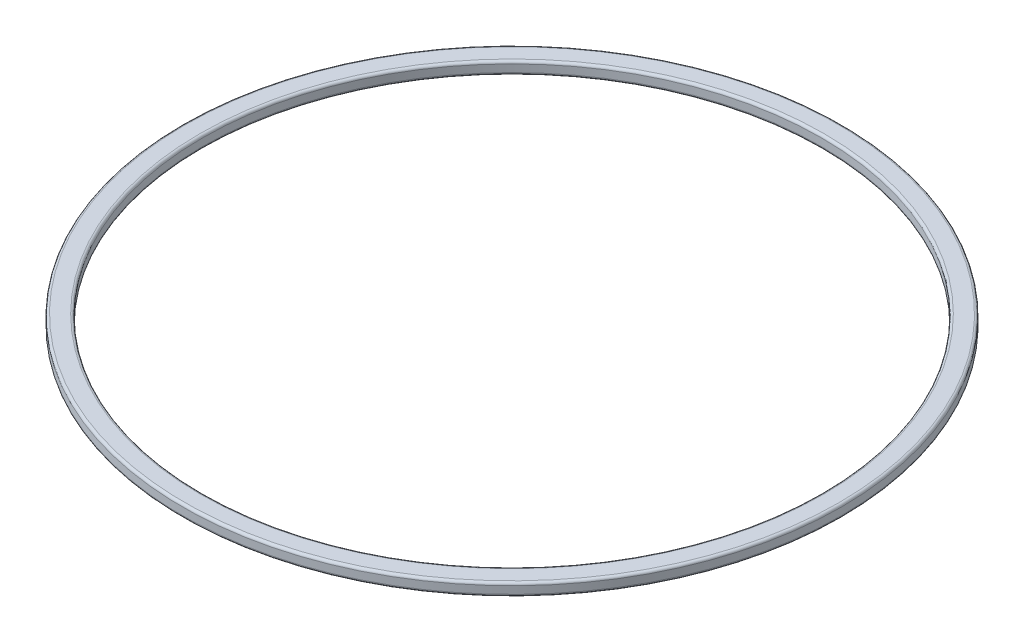
ISO-10303-21;
HEADER;
FILE_DESCRIPTION(('STEP AP214'),'2;1');
FILE_NAME('part.step','',(''),(''),'','','');
FILE_SCHEMA(('AUTOMOTIVE_DESIGN { 1 0 10303 214 1 1 1 1 }'));
ENDSEC;
DATA;
#1=APPLICATION_CONTEXT('core data for automotive mechanical design processes');
#2=APPLICATION_PROTOCOL_DEFINITION('international standard','automotive_design',2000,#1);
#3=PRODUCT_CONTEXT('',#1,'mechanical');
#4=PRODUCT('Part','Part','',(#3));
#5=PRODUCT_RELATED_PRODUCT_CATEGORY('part','',(#4));
#6=PRODUCT_DEFINITION_FORMATION('','',#4);
#7=PRODUCT_DEFINITION_CONTEXT('part definition',#1,'design');
#8=PRODUCT_DEFINITION('design','',#6,#7);
#9=PRODUCT_DEFINITION_SHAPE('','',#8);
#10=(LENGTH_UNIT() NAMED_UNIT(*) SI_UNIT(.MILLI.,.METRE.));
#11=(NAMED_UNIT(*) PLANE_ANGLE_UNIT() SI_UNIT($,.RADIAN.));
#12=(NAMED_UNIT(*) SI_UNIT($,.STERADIAN.) SOLID_ANGLE_UNIT());
#13=UNCERTAINTY_MEASURE_WITH_UNIT(LENGTH_MEASURE(1.E-05),#10,'distance_accuracy_value','');
#14=(GEOMETRIC_REPRESENTATION_CONTEXT(3) GLOBAL_UNCERTAINTY_ASSIGNED_CONTEXT((#13)) GLOBAL_UNIT_ASSIGNED_CONTEXT((#10,
#11,#12)) REPRESENTATION_CONTEXT('',''));
#15=CARTESIAN_POINT('',(0.,0.,0.));
#16=DIRECTION('',(0.,0.,1.));
#17=DIRECTION('',(1.,0.,0.));
#18=AXIS2_PLACEMENT_3D('',#15,#16,#17);
#19=CARTESIAN_POINT('',(66.,-2.,0.));
#20=DIRECTION('',(0.,-1.,0.));
#21=DIRECTION('',(-1.,0.,0.));
#22=AXIS2_PLACEMENT_3D('',#19,#20,#21);
#23=TOROIDAL_SURFACE('',#22,65.5,0.5);
#24=CARTESIAN_POINT('',(66.,-2.5,0.));
#25=DIRECTION('',(0.,-1.,0.));
#26=DIRECTION('',(-1.,0.,0.));
#27=AXIS2_PLACEMENT_3D('',#24,#25,#26);
#28=CIRCLE('',#27,65.5);
#29=CARTESIAN_POINT('',(131.5,-2.5,0.));
#30=VERTEX_POINT('',#29);
#31=EDGE_CURVE('E28',#30,#30,#28,.T.);
#32=ORIENTED_EDGE('',*,*,#31,.F.);
#33=CARTESIAN_POINT('',(131.5,-2.,0.));
#34=DIRECTION('',(0.,0.,1.));
#35=DIRECTION('',(1.,0.,0.));
#36=AXIS2_PLACEMENT_3D('',#33,#34,#35);
#37=CIRCLE('',#36,0.5);
#38=CARTESIAN_POINT('',(132.,-2.,0.));
#39=VERTEX_POINT('',#38);
#40=EDGE_CURVE('E11',#30,#39,#37,.T.);
#41=ORIENTED_EDGE('',*,*,#40,.T.);
#42=CARTESIAN_POINT('',(66.,-2.,0.));
#43=DIRECTION('',(0.,1.,0.));
#44=DIRECTION('',(-1.,0.,0.));
#45=AXIS2_PLACEMENT_3D('',#42,#43,#44);
#46=CIRCLE('',#45,66.);
#47=EDGE_CURVE('E92',#39,#39,#46,.T.);
#48=ORIENTED_EDGE('',*,*,#47,.F.);
#49=ORIENTED_EDGE('',*,*,#40,.F.);
#50=EDGE_LOOP('',(#32,#41,#48,#49));
#51=FACE_BOUND('',#50,.T.);
#52=ADVANCED_FACE('F17',(#51),#23,.T.);
#53=CARTESIAN_POINT('',(66.,-2.5,0.));
#54=DIRECTION('',(0.,-1.,0.));
#55=DIRECTION('',(0.,0.,-1.));
#56=AXIS2_PLACEMENT_3D('',#53,#54,#55);
#57=PLANE('',#56);
#58=CARTESIAN_POINT('',(66.,-2.5,0.));
#59=DIRECTION('',(0.,-1.,0.));
#60=DIRECTION('',(-1.,0.,0.));
#61=AXIS2_PLACEMENT_3D('',#58,#59,#60);
#62=CIRCLE('',#61,62.5);
#63=CARTESIAN_POINT('',(128.5,-2.5,0.));
#64=VERTEX_POINT('',#63);
#65=EDGE_CURVE('E97',#64,#64,#62,.T.);
#66=ORIENTED_EDGE('',*,*,#65,.F.);
#67=EDGE_LOOP('',(#66));
#68=FACE_BOUND('',#67,.T.);
#69=ORIENTED_EDGE('',*,*,#31,.T.);
#70=EDGE_LOOP('',(#69));
#71=FACE_BOUND('',#70,.T.);
#72=ADVANCED_FACE('F143',(#68,#71),#57,.T.);
#73=CARTESIAN_POINT('',(66.,-2.,0.));
#74=DIRECTION('',(0.,-1.,0.));
#75=DIRECTION('',(-1.,0.,0.));
#76=AXIS2_PLACEMENT_3D('',#73,#74,#75);
#77=TOROIDAL_SURFACE('',#76,62.5,0.5);
#78=CARTESIAN_POINT('',(66.,-2.,0.));
#79=DIRECTION('',(0.,-1.,0.));
#80=DIRECTION('',(-1.,0.,0.));
#81=AXIS2_PLACEMENT_3D('',#78,#79,#80);
#82=CIRCLE('',#81,62.);
#83=CARTESIAN_POINT('',(128.,-2.,0.));
#84=VERTEX_POINT('',#83);
#85=EDGE_CURVE('E86',#84,#84,#82,.T.);
#86=ORIENTED_EDGE('',*,*,#85,.F.);
#87=CARTESIAN_POINT('',(128.5,-2.,0.));
#88=DIRECTION('',(0.,0.,1.));
#89=DIRECTION('',(1.,0.,0.));
#90=AXIS2_PLACEMENT_3D('',#87,#88,#89);
#91=CIRCLE('',#90,0.5);
#92=EDGE_CURVE('E90',#84,#64,#91,.T.);
#93=ORIENTED_EDGE('',*,*,#92,.T.);
#94=ORIENTED_EDGE('',*,*,#65,.T.);
#95=ORIENTED_EDGE('',*,*,#92,.F.);
#96=EDGE_LOOP('',(#86,#93,#94,#95));
#97=FACE_BOUND('',#96,.T.);
#98=ADVANCED_FACE('F147',(#97),#77,.T.);
#99=CARTESIAN_POINT('',(66.,0.125,0.));
#100=DIRECTION('',(0.,-1.,0.));
#101=DIRECTION('',(-1.,0.,0.));
#102=AXIS2_PLACEMENT_3D('',#99,#100,#101);
#103=CYLINDRICAL_SURFACE('',#102,62.);
#104=CARTESIAN_POINT('',(66.,-0.5,0.));
#105=DIRECTION('',(0.,-1.,0.));
#106=DIRECTION('',(-1.,0.,0.));
#107=AXIS2_PLACEMENT_3D('',#104,#105,#106);
#108=CIRCLE('',#107,62.);
#109=CARTESIAN_POINT('',(128.,-0.5,0.));
#110=VERTEX_POINT('',#109);
#111=EDGE_CURVE('E103',#110,#110,#108,.T.);
#112=ORIENTED_EDGE('',*,*,#111,.F.);
#113=DIRECTION('',(0.,-1.,0.));
#114=VECTOR('',#113,1.);
#115=CARTESIAN_POINT('',(128.,0.125,0.));
#116=LINE('',#115,#114);
#117=EDGE_CURVE('E91',#110,#84,#116,.T.);
#118=ORIENTED_EDGE('',*,*,#117,.T.);
#119=ORIENTED_EDGE('',*,*,#85,.T.);
#120=ORIENTED_EDGE('',*,*,#117,.F.);
#121=EDGE_LOOP('',(#112,#118,#119,#120));
#122=FACE_BOUND('',#121,.T.);
#123=ADVANCED_FACE('F124',(#122),#103,.F.);
#124=CARTESIAN_POINT('',(66.,-0.5,0.));
#125=DIRECTION('',(0.,-1.,0.));
#126=DIRECTION('',(-1.,0.,0.));
#127=AXIS2_PLACEMENT_3D('',#124,#125,#126);
#128=TOROIDAL_SURFACE('',#127,62.5,0.5);
#129=CARTESIAN_POINT('',(66.,0.,0.));
#130=DIRECTION('',(0.,-1.,0.));
#131=DIRECTION('',(-1.,0.,0.));
#132=AXIS2_PLACEMENT_3D('',#129,#130,#131);
#133=CIRCLE('',#132,62.5);
#134=CARTESIAN_POINT('',(128.5,0.,0.));
#135=VERTEX_POINT('',#134);
#136=EDGE_CURVE('E75',#135,#135,#133,.T.);
#137=ORIENTED_EDGE('',*,*,#136,.F.);
#138=CARTESIAN_POINT('',(128.5,-0.5,0.));
#139=DIRECTION('',(0.,0.,1.));
#140=DIRECTION('',(1.,0.,0.));
#141=AXIS2_PLACEMENT_3D('',#138,#139,#140);
#142=CIRCLE('',#141,0.5);
#143=EDGE_CURVE('E82',#135,#110,#142,.T.);
#144=ORIENTED_EDGE('',*,*,#143,.T.);
#145=ORIENTED_EDGE('',*,*,#111,.T.);
#146=ORIENTED_EDGE('',*,*,#143,.F.);
#147=EDGE_LOOP('',(#137,#144,#145,#146));
#148=FACE_BOUND('',#147,.T.);
#149=ADVANCED_FACE('F19',(#148),#128,.T.);
#150=CARTESIAN_POINT('',(66.,0.,0.));
#151=DIRECTION('',(0.,-1.,0.));
#152=DIRECTION('',(0.,0.,-1.));
#153=AXIS2_PLACEMENT_3D('',#150,#151,#152);
#154=PLANE('',#153);
#155=ORIENTED_EDGE('',*,*,#136,.T.);
#156=EDGE_LOOP('',(#155));
#157=FACE_BOUND('',#156,.T.);
#158=CARTESIAN_POINT('',(66.,0.,0.));
#159=DIRECTION('',(0.,1.,0.));
#160=DIRECTION('',(-1.,0.,0.));
#161=AXIS2_PLACEMENT_3D('',#158,#159,#160);
#162=CIRCLE('',#161,65.5);
#163=CARTESIAN_POINT('',(131.5,0.,0.));
#164=VERTEX_POINT('',#163);
#165=EDGE_CURVE('E72',#164,#164,#162,.T.);
#166=ORIENTED_EDGE('',*,*,#165,.T.);
#167=EDGE_LOOP('',(#166));
#168=FACE_BOUND('',#167,.T.);
#169=ADVANCED_FACE('F73',(#157,#168),#154,.F.);
#170=CARTESIAN_POINT('',(66.,-0.5,0.));
#171=DIRECTION('',(0.,-1.,0.));
#172=DIRECTION('',(-1.,0.,0.));
#173=AXIS2_PLACEMENT_3D('',#170,#171,#172);
#174=TOROIDAL_SURFACE('',#173,65.5,0.5);
#175=CARTESIAN_POINT('',(66.,-0.5,0.));
#176=DIRECTION('',(0.,-1.,0.));
#177=DIRECTION('',(-1.,0.,0.));
#178=AXIS2_PLACEMENT_3D('',#175,#176,#177);
#179=CIRCLE('',#178,66.);
#180=CARTESIAN_POINT('',(132.,-0.5,0.));
#181=VERTEX_POINT('',#180);
#182=EDGE_CURVE('E84',#181,#181,#179,.T.);
#183=ORIENTED_EDGE('',*,*,#182,.F.);
#184=CARTESIAN_POINT('',(131.5,-0.5,0.));
#185=DIRECTION('',(0.,0.,1.));
#186=DIRECTION('',(1.,0.,0.));
#187=AXIS2_PLACEMENT_3D('',#184,#185,#186);
#188=CIRCLE('',#187,0.5);
#189=EDGE_CURVE('E21',#181,#164,#188,.T.);
#190=ORIENTED_EDGE('',*,*,#189,.T.);
#191=ORIENTED_EDGE('',*,*,#165,.F.);
#192=ORIENTED_EDGE('',*,*,#189,.F.);
#193=EDGE_LOOP('',(#183,#190,#191,#192));
#194=FACE_BOUND('',#193,.T.);
#195=ADVANCED_FACE('F131',(#194),#174,.T.);
#196=CARTESIAN_POINT('',(66.,0.125,0.));
#197=DIRECTION('',(0.,-1.,0.));
#198=DIRECTION('',(-1.,0.,0.));
#199=AXIS2_PLACEMENT_3D('',#196,#197,#198);
#200=CYLINDRICAL_SURFACE('',#199,66.);
#201=ORIENTED_EDGE('',*,*,#47,.T.);
#202=DIRECTION('',(0.,1.,0.));
#203=VECTOR('',#202,1.);
#204=CARTESIAN_POINT('',(132.,0.125,0.));
#205=LINE('',#204,#203);
#206=EDGE_CURVE('E96',#39,#181,#205,.T.);
#207=ORIENTED_EDGE('',*,*,#206,.T.);
#208=ORIENTED_EDGE('',*,*,#182,.T.);
#209=ORIENTED_EDGE('',*,*,#206,.F.);
#210=EDGE_LOOP('',(#201,#207,#208,#209));
#211=FACE_BOUND('',#210,.T.);
#212=ADVANCED_FACE('F138',(#211),#200,.T.);
#213=CLOSED_SHELL('',(#52,#72,#98,#123,#149,#169,#195,#212));
#214=MANIFOLD_SOLID_BREP('B1',#213);
#215=ADVANCED_BREP_SHAPE_REPRESENTATION('',(#18,#214),#14);
#216=SHAPE_DEFINITION_REPRESENTATION(#9,#215);
ENDSEC;
END-ISO-10303-21;
